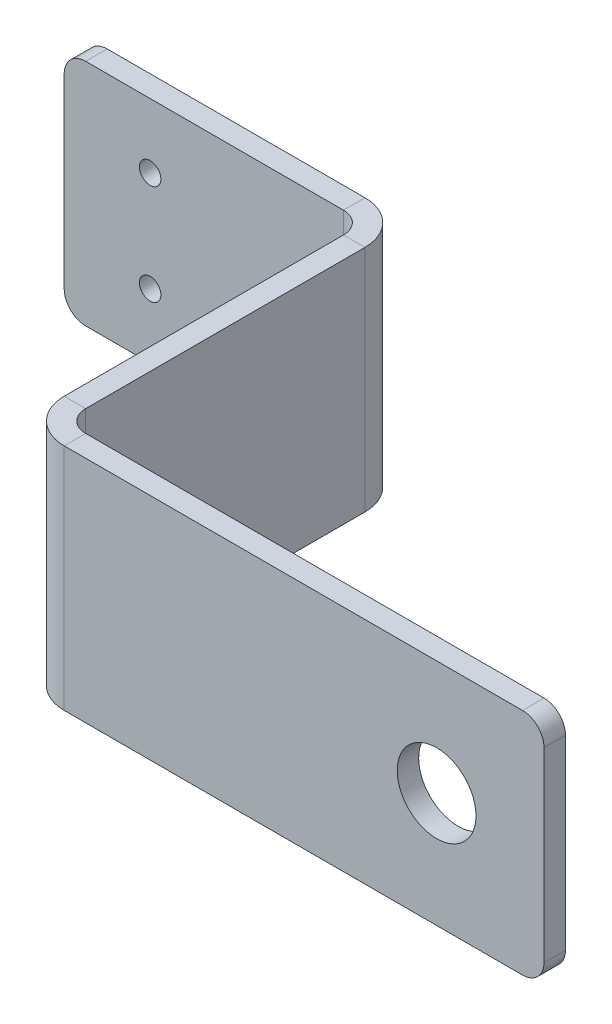
ISO-10303-21;
HEADER;
FILE_DESCRIPTION(('STEP AP214'),'2;1');
FILE_NAME('part.step','',(''),(''),'','','');
FILE_SCHEMA(('AUTOMOTIVE_DESIGN { 1 0 10303 214 1 1 1 1 }'));
ENDSEC;
DATA;
#1=APPLICATION_CONTEXT('core data for automotive mechanical design processes');
#2=APPLICATION_PROTOCOL_DEFINITION('international standard','automotive_design',2000,#1);
#3=PRODUCT_CONTEXT('',#1,'mechanical');
#4=PRODUCT('Part','Part','',(#3));
#5=PRODUCT_RELATED_PRODUCT_CATEGORY('part','',(#4));
#6=PRODUCT_DEFINITION_FORMATION('','',#4);
#7=PRODUCT_DEFINITION_CONTEXT('part definition',#1,'design');
#8=PRODUCT_DEFINITION('design','',#6,#7);
#9=PRODUCT_DEFINITION_SHAPE('','',#8);
#10=(LENGTH_UNIT() NAMED_UNIT(*) SI_UNIT(.MILLI.,.METRE.));
#11=(NAMED_UNIT(*) PLANE_ANGLE_UNIT() SI_UNIT($,.RADIAN.));
#12=(NAMED_UNIT(*) SI_UNIT($,.STERADIAN.) SOLID_ANGLE_UNIT());
#13=UNCERTAINTY_MEASURE_WITH_UNIT(LENGTH_MEASURE(1.E-05),#10,'distance_accuracy_value','');
#14=(GEOMETRIC_REPRESENTATION_CONTEXT(3) GLOBAL_UNCERTAINTY_ASSIGNED_CONTEXT((#13)) GLOBAL_UNIT_ASSIGNED_CONTEXT((#10,
#11,#12)) REPRESENTATION_CONTEXT('',''));
#15=CARTESIAN_POINT('',(0.,0.,0.));
#16=DIRECTION('',(0.,0.,1.));
#17=DIRECTION('',(1.,0.,0.));
#18=AXIS2_PLACEMENT_3D('',#15,#16,#17);
#19=CARTESIAN_POINT('',(-70.,32.,-42.));
#20=DIRECTION('',(0.,1.,0.));
#21=DIRECTION('',(0.,0.,1.));
#22=AXIS2_PLACEMENT_3D('',#19,#20,#21);
#23=PLANE('',#22);
#24=DIRECTION('',(-1.,0.,0.));
#25=VECTOR('',#24,1.);
#26=CARTESIAN_POINT('',(-70.,32.,-42.));
#27=LINE('',#26,#25);
#28=CARTESIAN_POINT('',(-70.,32.,-42.));
#29=VERTEX_POINT('',#28);
#30=CARTESIAN_POINT('',(-73.,32.,-42.));
#31=VERTEX_POINT('',#30);
#32=EDGE_CURVE('E279',#29,#31,#27,.T.);
#33=ORIENTED_EDGE('',*,*,#32,.F.);
#34=CARTESIAN_POINT('',(-76.,32.,-42.));
#35=DIRECTION('',(0.,1.,0.));
#36=DIRECTION('',(0.,0.,1.));
#37=AXIS2_PLACEMENT_3D('',#34,#35,#36);
#38=CIRCLE('',#37,6.);
#39=CARTESIAN_POINT('',(-76.,32.,-48.));
#40=VERTEX_POINT('',#39);
#41=EDGE_CURVE('E196',#40,#29,#38,.F.);
#42=ORIENTED_EDGE('',*,*,#41,.F.);
#43=DIRECTION('',(0.,0.,-1.));
#44=VECTOR('',#43,1.);
#45=CARTESIAN_POINT('',(-76.,32.,-45.));
#46=LINE('',#45,#44);
#47=CARTESIAN_POINT('',(-76.,32.,-45.));
#48=VERTEX_POINT('',#47);
#49=EDGE_CURVE('E276',#48,#40,#46,.T.);
#50=ORIENTED_EDGE('',*,*,#49,.F.);
#51=CARTESIAN_POINT('',(-76.,32.,-42.));
#52=DIRECTION('',(0.,1.,0.));
#53=DIRECTION('',(1.,0.,0.));
#54=AXIS2_PLACEMENT_3D('',#51,#52,#53);
#55=CIRCLE('',#54,3.);
#56=EDGE_CURVE('E206',#48,#31,#55,.F.);
#57=ORIENTED_EDGE('',*,*,#56,.T.);
#58=EDGE_LOOP('',(#33,#42,#50,#57));
#59=FACE_BOUND('',#58,.T.);
#60=ADVANCED_FACE('F41',(#59),#23,.T.);
#61=CARTESIAN_POINT('',(-76.,32.,-45.));
#62=DIRECTION('',(0.,1.,0.));
#63=DIRECTION('',(0.,0.,1.));
#64=AXIS2_PLACEMENT_3D('',#61,#62,#63);
#65=PLANE('',#64);
#66=DIRECTION('',(0.,0.,1.));
#67=VECTOR('',#66,1.);
#68=CARTESIAN_POINT('',(-70.,32.,-48.));
#69=LINE('',#68,#67);
#70=CARTESIAN_POINT('',(-70.,32.,-3.));
#71=VERTEX_POINT('',#70);
#72=EDGE_CURVE('E194',#29,#71,#69,.T.);
#73=ORIENTED_EDGE('',*,*,#72,.F.);
#74=ORIENTED_EDGE('',*,*,#32,.T.);
#75=DIRECTION('',(0.,0.,-1.));
#76=VECTOR('',#75,1.);
#77=CARTESIAN_POINT('',(-73.,32.,-48.));
#78=LINE('',#77,#76);
#79=CARTESIAN_POINT('',(-73.,32.,-3.));
#80=VERTEX_POINT('',#79);
#81=EDGE_CURVE('E209',#31,#80,#78,.F.);
#82=ORIENTED_EDGE('',*,*,#81,.T.);
#83=DIRECTION('',(1.,0.,0.));
#84=VECTOR('',#83,1.);
#85=CARTESIAN_POINT('',(-73.,32.,-3.));
#86=LINE('',#85,#84);
#87=EDGE_CURVE('E168',#80,#71,#86,.T.);
#88=ORIENTED_EDGE('',*,*,#87,.T.);
#89=EDGE_LOOP('',(#73,#74,#82,#88));
#90=FACE_BOUND('',#89,.T.);
#91=ADVANCED_FACE('F345',(#90),#65,.T.);
#92=CARTESIAN_POINT('',(-76.,0.,-48.));
#93=DIRECTION('',(0.,-1.,0.));
#94=DIRECTION('',(0.,0.,-1.));
#95=AXIS2_PLACEMENT_3D('',#92,#93,#94);
#96=PLANE('',#95);
#97=DIRECTION('',(0.,0.,1.));
#98=VECTOR('',#97,1.);
#99=CARTESIAN_POINT('',(-76.,0.,-48.));
#100=LINE('',#99,#98);
#101=CARTESIAN_POINT('',(-76.,0.,-48.));
#102=VERTEX_POINT('',#101);
#103=CARTESIAN_POINT('',(-76.,0.,-45.));
#104=VERTEX_POINT('',#103);
#105=EDGE_CURVE('E273',#102,#104,#100,.T.);
#106=ORIENTED_EDGE('',*,*,#105,.F.);
#107=CARTESIAN_POINT('',(-76.,0.,-42.));
#108=DIRECTION('',(0.,1.,0.));
#109=DIRECTION('',(0.,0.,1.));
#110=AXIS2_PLACEMENT_3D('',#107,#108,#109);
#111=CIRCLE('',#110,6.);
#112=CARTESIAN_POINT('',(-70.,0.,-42.));
#113=VERTEX_POINT('',#112);
#114=EDGE_CURVE('E224',#102,#113,#111,.F.);
#115=ORIENTED_EDGE('',*,*,#114,.T.);
#116=DIRECTION('',(1.,0.,0.));
#117=VECTOR('',#116,1.);
#118=CARTESIAN_POINT('',(-73.,0.,-42.));
#119=LINE('',#118,#117);
#120=CARTESIAN_POINT('',(-73.,0.,-42.));
#121=VERTEX_POINT('',#120);
#122=EDGE_CURVE('E167',#121,#113,#119,.T.);
#123=ORIENTED_EDGE('',*,*,#122,.F.);
#124=CARTESIAN_POINT('',(-76.,0.,-42.));
#125=DIRECTION('',(0.,1.,0.));
#126=DIRECTION('',(1.,0.,0.));
#127=AXIS2_PLACEMENT_3D('',#124,#125,#126);
#128=CIRCLE('',#127,3.);
#129=EDGE_CURVE('E231',#104,#121,#128,.F.);
#130=ORIENTED_EDGE('',*,*,#129,.F.);
#131=EDGE_LOOP('',(#106,#115,#123,#130));
#132=FACE_BOUND('',#131,.T.);
#133=ADVANCED_FACE('F399',(#132),#96,.T.);
#134=CARTESIAN_POINT('',(-73.,0.,-42.));
#135=DIRECTION('',(0.,-1.,0.));
#136=DIRECTION('',(0.,0.,-1.));
#137=AXIS2_PLACEMENT_3D('',#134,#135,#136);
#138=PLANE('',#137);
#139=DIRECTION('',(1.,0.,0.));
#140=VECTOR('',#139,1.);
#141=CARTESIAN_POINT('',(-115.,0.,-45.));
#142=LINE('',#141,#140);
#143=CARTESIAN_POINT('',(-112.,0.,-45.));
#144=VERTEX_POINT('',#143);
#145=EDGE_CURVE('E229',#144,#104,#142,.T.);
#146=ORIENTED_EDGE('',*,*,#145,.F.);
#147=DIRECTION('',(0.,0.,-1.));
#148=VECTOR('',#147,1.);
#149=CARTESIAN_POINT('',(-112.,0.,-42.));
#150=LINE('',#149,#148);
#151=CARTESIAN_POINT('',(-112.,0.,-48.));
#152=VERTEX_POINT('',#151);
#153=EDGE_CURVE('E298',#144,#152,#150,.T.);
#154=ORIENTED_EDGE('',*,*,#153,.T.);
#155=DIRECTION('',(1.,0.,0.));
#156=VECTOR('',#155,1.);
#157=CARTESIAN_POINT('',(-115.,0.,-48.));
#158=LINE('',#157,#156);
#159=EDGE_CURVE('E227',#152,#102,#158,.T.);
#160=ORIENTED_EDGE('',*,*,#159,.T.);
#161=ORIENTED_EDGE('',*,*,#105,.T.);
#162=EDGE_LOOP('',(#146,#154,#160,#161));
#163=FACE_BOUND('',#162,.T.);
#164=ADVANCED_FACE('F318',(#163),#138,.T.);
#165=CARTESIAN_POINT('',(-67.,32.,0.));
#166=DIRECTION('',(0.,1.,0.));
#167=DIRECTION('',(0.,0.,1.));
#168=AXIS2_PLACEMENT_3D('',#165,#166,#167);
#169=PLANE('',#168);
#170=DIRECTION('',(0.,0.,1.));
#171=VECTOR('',#170,1.);
#172=CARTESIAN_POINT('',(-67.,32.,0.));
#173=LINE('',#172,#171);
#174=CARTESIAN_POINT('',(-67.,32.,0.));
#175=VERTEX_POINT('',#174);
#176=CARTESIAN_POINT('',(-67.,32.,3.));
#177=VERTEX_POINT('',#176);
#178=EDGE_CURVE('E155',#175,#177,#173,.T.);
#179=ORIENTED_EDGE('',*,*,#178,.F.);
#180=CARTESIAN_POINT('',(-67.,32.,-3.));
#181=DIRECTION('',(0.,-1.,0.));
#182=DIRECTION('',(0.,0.,-1.));
#183=AXIS2_PLACEMENT_3D('',#180,#181,#182);
#184=CIRCLE('',#183,3.);
#185=EDGE_CURVE('E159',#71,#175,#184,.F.);
#186=ORIENTED_EDGE('',*,*,#185,.F.);
#187=ORIENTED_EDGE('',*,*,#87,.F.);
#188=CARTESIAN_POINT('',(-67.,32.,-3.));
#189=DIRECTION('',(0.,1.,0.));
#190=DIRECTION('',(1.,0.,0.));
#191=AXIS2_PLACEMENT_3D('',#188,#189,#190);
#192=CIRCLE('',#191,6.);
#193=EDGE_CURVE('E162',#80,#177,#192,.T.);
#194=ORIENTED_EDGE('',*,*,#193,.T.);
#195=EDGE_LOOP('',(#179,#186,#187,#194));
#196=FACE_BOUND('',#195,.T.);
#197=ADVANCED_FACE('F157',(#196),#169,.T.);
#198=CARTESIAN_POINT('',(-73.,32.,-3.));
#199=DIRECTION('',(0.,1.,0.));
#200=DIRECTION('',(0.,0.,1.));
#201=AXIS2_PLACEMENT_3D('',#198,#199,#200);
#202=PLANE('',#201);
#203=DIRECTION('',(1.,0.,0.));
#204=VECTOR('',#203,1.);
#205=CARTESIAN_POINT('',(-70.,32.,3.));
#206=LINE('',#205,#204);
#207=CARTESIAN_POINT('',(-3.,32.,3.));
#208=VERTEX_POINT('',#207);
#209=EDGE_CURVE('E189',#177,#208,#206,.T.);
#210=ORIENTED_EDGE('',*,*,#209,.T.);
#211=DIRECTION('',(0.,0.,1.));
#212=VECTOR('',#211,1.);
#213=CARTESIAN_POINT('',(-3.,32.,-3.));
#214=LINE('',#213,#212);
#215=CARTESIAN_POINT('',(-3.,32.,0.));
#216=VERTEX_POINT('',#215);
#217=EDGE_CURVE('E188',#208,#216,#214,.F.);
#218=ORIENTED_EDGE('',*,*,#217,.T.);
#219=DIRECTION('',(1.,0.,0.));
#220=VECTOR('',#219,1.);
#221=CARTESIAN_POINT('',(-70.,32.,0.));
#222=LINE('',#221,#220);
#223=EDGE_CURVE('E176',#175,#216,#222,.T.);
#224=ORIENTED_EDGE('',*,*,#223,.F.);
#225=ORIENTED_EDGE('',*,*,#178,.T.);
#226=EDGE_LOOP('',(#210,#218,#224,#225));
#227=FACE_BOUND('',#226,.T.);
#228=ADVANCED_FACE('F186',(#227),#202,.T.);
#229=CARTESIAN_POINT('',(-70.,0.,-3.));
#230=DIRECTION('',(0.,-1.,0.));
#231=DIRECTION('',(0.,0.,-1.));
#232=AXIS2_PLACEMENT_3D('',#229,#230,#231);
#233=PLANE('',#232);
#234=DIRECTION('',(-1.,0.,0.));
#235=VECTOR('',#234,1.);
#236=CARTESIAN_POINT('',(-70.,0.,-3.));
#237=LINE('',#236,#235);
#238=CARTESIAN_POINT('',(-70.,0.,-3.));
#239=VERTEX_POINT('',#238);
#240=CARTESIAN_POINT('',(-73.,0.,-3.));
#241=VERTEX_POINT('',#240);
#242=EDGE_CURVE('E269',#239,#241,#237,.T.);
#243=ORIENTED_EDGE('',*,*,#242,.F.);
#244=CARTESIAN_POINT('',(-67.,0.,-3.));
#245=DIRECTION('',(0.,-1.,0.));
#246=DIRECTION('',(0.,0.,-1.));
#247=AXIS2_PLACEMENT_3D('',#244,#245,#246);
#248=CIRCLE('',#247,3.);
#249=CARTESIAN_POINT('',(-67.,0.,0.));
#250=VERTEX_POINT('',#249);
#251=EDGE_CURVE('E219',#239,#250,#248,.F.);
#252=ORIENTED_EDGE('',*,*,#251,.T.);
#253=DIRECTION('',(0.,0.,-1.));
#254=VECTOR('',#253,1.);
#255=CARTESIAN_POINT('',(-67.,0.,3.));
#256=LINE('',#255,#254);
#257=CARTESIAN_POINT('',(-67.,0.,3.));
#258=VERTEX_POINT('',#257);
#259=EDGE_CURVE('E267',#258,#250,#256,.T.);
#260=ORIENTED_EDGE('',*,*,#259,.F.);
#261=CARTESIAN_POINT('',(-67.,0.,-3.));
#262=DIRECTION('',(0.,1.,0.));
#263=DIRECTION('',(1.,0.,0.));
#264=AXIS2_PLACEMENT_3D('',#261,#262,#263);
#265=CIRCLE('',#264,6.);
#266=EDGE_CURVE('E237',#241,#258,#265,.T.);
#267=ORIENTED_EDGE('',*,*,#266,.F.);
#268=EDGE_LOOP('',(#243,#252,#260,#267));
#269=FACE_BOUND('',#268,.T.);
#270=ADVANCED_FACE('F391',(#269),#233,.T.);
#271=CARTESIAN_POINT('',(-67.,0.,3.));
#272=DIRECTION('',(0.,-1.,0.));
#273=DIRECTION('',(0.,0.,-1.));
#274=AXIS2_PLACEMENT_3D('',#271,#272,#273);
#275=PLANE('',#274);
#276=DIRECTION('',(0.,0.,1.));
#277=VECTOR('',#276,1.);
#278=CARTESIAN_POINT('',(-70.,0.,-48.));
#279=LINE('',#278,#277);
#280=EDGE_CURVE('E221',#113,#239,#279,.T.);
#281=ORIENTED_EDGE('',*,*,#280,.T.);
#282=ORIENTED_EDGE('',*,*,#242,.T.);
#283=DIRECTION('',(0.,0.,-1.));
#284=VECTOR('',#283,1.);
#285=CARTESIAN_POINT('',(-73.,0.,-48.));
#286=LINE('',#285,#284);
#287=EDGE_CURVE('E234',#121,#241,#286,.F.);
#288=ORIENTED_EDGE('',*,*,#287,.F.);
#289=ORIENTED_EDGE('',*,*,#122,.T.);
#290=EDGE_LOOP('',(#281,#282,#288,#289));
#291=FACE_BOUND('',#290,.T.);
#292=ADVANCED_FACE('F382',(#291),#275,.T.);
#293=CARTESIAN_POINT('',(-70.,32.,3.));
#294=DIRECTION('',(0.,0.,-1.));
#295=DIRECTION('',(-1.,0.,0.));
#296=AXIS2_PLACEMENT_3D('',#293,#294,#295);
#297=PLANE('',#296);
#298=CARTESIAN_POINT('',(-15.,16.,3.));
#299=DIRECTION('',(0.,0.,1.));
#300=DIRECTION('',(1.,0.,0.));
#301=AXIS2_PLACEMENT_3D('',#298,#299,#300);
#302=CIRCLE('',#301,5.5);
#303=CARTESIAN_POINT('',(-9.5,16.,3.));
#304=VERTEX_POINT('',#303);
#305=EDGE_CURVE('E364',#304,#304,#302,.T.);
#306=ORIENTED_EDGE('',*,*,#305,.F.);
#307=EDGE_LOOP('',(#306));
#308=FACE_BOUND('',#307,.T.);
#309=DIRECTION('',(0.,-1.,0.));
#310=VECTOR('',#309,1.);
#311=CARTESIAN_POINT('',(0.,32.,3.));
#312=LINE('',#311,#310);
#313=CARTESIAN_POINT('',(0.,29.,3.));
#314=VERTEX_POINT('',#313);
#315=CARTESIAN_POINT('',(0.,3.,3.));
#316=VERTEX_POINT('',#315);
#317=EDGE_CURVE('E264',#314,#316,#312,.T.);
#318=ORIENTED_EDGE('',*,*,#317,.F.);
#319=CARTESIAN_POINT('',(-3.,29.,3.));
#320=DIRECTION('',(0.,0.,-1.));
#321=DIRECTION('',(-1.,0.,0.));
#322=AXIS2_PLACEMENT_3D('',#319,#320,#321);
#323=CIRCLE('',#322,3.);
#324=EDGE_CURVE('E288',#314,#208,#323,.F.);
#325=ORIENTED_EDGE('',*,*,#324,.T.);
#326=ORIENTED_EDGE('',*,*,#209,.F.);
#327=DIRECTION('',(0.,-1.,0.));
#328=VECTOR('',#327,1.);
#329=CARTESIAN_POINT('',(-67.,32.,3.));
#330=LINE('',#329,#328);
#331=EDGE_CURVE('E213',#177,#258,#330,.T.);
#332=ORIENTED_EDGE('',*,*,#331,.T.);
#333=DIRECTION('',(1.,0.,0.));
#334=VECTOR('',#333,1.);
#335=CARTESIAN_POINT('',(-70.,0.,3.));
#336=LINE('',#335,#334);
#337=CARTESIAN_POINT('',(-3.,0.,3.));
#338=VERTEX_POINT('',#337);
#339=EDGE_CURVE('E214',#258,#338,#336,.T.);
#340=ORIENTED_EDGE('',*,*,#339,.T.);
#341=CARTESIAN_POINT('',(-3.,3.,3.));
#342=DIRECTION('',(0.,0.,-1.));
#343=DIRECTION('',(-1.,0.,0.));
#344=AXIS2_PLACEMENT_3D('',#341,#342,#343);
#345=CIRCLE('',#344,3.);
#346=EDGE_CURVE('E286',#338,#316,#345,.F.);
#347=ORIENTED_EDGE('',*,*,#346,.T.);
#348=EDGE_LOOP('',(#318,#325,#326,#332,#340,#347));
#349=FACE_BOUND('',#348,.T.);
#350=ADVANCED_FACE('F358',(#308,#349),#297,.F.);
#351=CARTESIAN_POINT('',(0.,32.,0.));
#352=DIRECTION('',(1.,0.,0.));
#353=DIRECTION('',(0.,0.,-1.));
#354=AXIS2_PLACEMENT_3D('',#351,#352,#353);
#355=PLANE('',#354);
#356=DIRECTION('',(0.,-1.,0.));
#357=VECTOR('',#356,1.);
#358=CARTESIAN_POINT('',(0.,32.,0.));
#359=LINE('',#358,#357);
#360=CARTESIAN_POINT('',(0.,29.,0.));
#361=VERTEX_POINT('',#360);
#362=CARTESIAN_POINT('',(0.,3.,0.));
#363=VERTEX_POINT('',#362);
#364=EDGE_CURVE('E183',#361,#363,#359,.T.);
#365=ORIENTED_EDGE('',*,*,#364,.F.);
#366=DIRECTION('',(0.,0.,1.));
#367=VECTOR('',#366,1.);
#368=CARTESIAN_POINT('',(0.,29.,0.));
#369=LINE('',#368,#367);
#370=EDGE_CURVE('E283',#361,#314,#369,.T.);
#371=ORIENTED_EDGE('',*,*,#370,.T.);
#372=ORIENTED_EDGE('',*,*,#317,.T.);
#373=DIRECTION('',(0.,0.,1.));
#374=VECTOR('',#373,1.);
#375=CARTESIAN_POINT('',(0.,3.,0.));
#376=LINE('',#375,#374);
#377=EDGE_CURVE('E281',#316,#363,#376,.F.);
#378=ORIENTED_EDGE('',*,*,#377,.T.);
#379=EDGE_LOOP('',(#365,#371,#372,#378));
#380=FACE_BOUND('',#379,.T.);
#381=ADVANCED_FACE('F381',(#380),#355,.T.);
#382=CARTESIAN_POINT('',(-70.,32.,0.));
#383=DIRECTION('',(0.,0.,-1.));
#384=DIRECTION('',(-1.,0.,0.));
#385=AXIS2_PLACEMENT_3D('',#382,#383,#384);
#386=PLANE('',#385);
#387=CARTESIAN_POINT('',(-15.,16.,0.));
#388=DIRECTION('',(0.,0.,-1.));
#389=DIRECTION('',(-1.,0.,0.));
#390=AXIS2_PLACEMENT_3D('',#387,#388,#389);
#391=CIRCLE('',#390,5.5);
#392=CARTESIAN_POINT('',(-20.5,16.,0.));
#393=VERTEX_POINT('',#392);
#394=EDGE_CURVE('E372',#393,#393,#391,.F.);
#395=ORIENTED_EDGE('',*,*,#394,.T.);
#396=EDGE_LOOP('',(#395));
#397=FACE_BOUND('',#396,.T.);
#398=ORIENTED_EDGE('',*,*,#223,.T.);
#399=CARTESIAN_POINT('',(-3.,29.,0.));
#400=DIRECTION('',(0.,0.,-1.));
#401=DIRECTION('',(-1.,0.,0.));
#402=AXIS2_PLACEMENT_3D('',#399,#400,#401);
#403=CIRCLE('',#402,3.);
#404=EDGE_CURVE('E293',#216,#361,#403,.T.);
#405=ORIENTED_EDGE('',*,*,#404,.T.);
#406=ORIENTED_EDGE('',*,*,#364,.T.);
#407=CARTESIAN_POINT('',(-3.,3.,0.));
#408=DIRECTION('',(0.,0.,-1.));
#409=DIRECTION('',(-1.,0.,0.));
#410=AXIS2_PLACEMENT_3D('',#407,#408,#409);
#411=CIRCLE('',#410,3.);
#412=CARTESIAN_POINT('',(-3.,0.,0.));
#413=VERTEX_POINT('',#412);
#414=EDGE_CURVE('E291',#363,#413,#411,.T.);
#415=ORIENTED_EDGE('',*,*,#414,.T.);
#416=DIRECTION('',(1.,0.,0.));
#417=VECTOR('',#416,1.);
#418=CARTESIAN_POINT('',(-70.,0.,0.));
#419=LINE('',#418,#417);
#420=EDGE_CURVE('E179',#250,#413,#419,.T.);
#421=ORIENTED_EDGE('',*,*,#420,.F.);
#422=DIRECTION('',(0.,-1.,0.));
#423=VECTOR('',#422,1.);
#424=CARTESIAN_POINT('',(-67.,32.,0.));
#425=LINE('',#424,#423);
#426=EDGE_CURVE('E174',#175,#250,#425,.T.);
#427=ORIENTED_EDGE('',*,*,#426,.F.);
#428=EDGE_LOOP('',(#398,#405,#406,#415,#421,#427));
#429=FACE_BOUND('',#428,.T.);
#430=ADVANCED_FACE('F175',(#397,#429),#386,.T.);
#431=CARTESIAN_POINT('',(-67.,32.,-3.));
#432=DIRECTION('',(0.,-1.,0.));
#433=DIRECTION('',(0.,0.,-1.));
#434=AXIS2_PLACEMENT_3D('',#431,#432,#433);
#435=CYLINDRICAL_SURFACE('',#434,3.);
#436=ORIENTED_EDGE('',*,*,#251,.F.);
#437=DIRECTION('',(0.,-1.,0.));
#438=VECTOR('',#437,1.);
#439=CARTESIAN_POINT('',(-70.,32.,-3.));
#440=LINE('',#439,#438);
#441=EDGE_CURVE('E184',#71,#239,#440,.T.);
#442=ORIENTED_EDGE('',*,*,#441,.F.);
#443=ORIENTED_EDGE('',*,*,#185,.T.);
#444=ORIENTED_EDGE('',*,*,#426,.T.);
#445=EDGE_LOOP('',(#436,#442,#443,#444));
#446=FACE_BOUND('',#445,.T.);
#447=ADVANCED_FACE('F192',(#446),#435,.F.);
#448=CARTESIAN_POINT('',(-70.,32.,-48.));
#449=DIRECTION('',(1.,0.,0.));
#450=DIRECTION('',(0.,0.,-1.));
#451=AXIS2_PLACEMENT_3D('',#448,#449,#450);
#452=PLANE('',#451);
#453=ORIENTED_EDGE('',*,*,#280,.F.);
#454=DIRECTION('',(0.,-1.,0.));
#455=VECTOR('',#454,1.);
#456=CARTESIAN_POINT('',(-70.,32.,-42.));
#457=LINE('',#456,#455);
#458=EDGE_CURVE('E258',#29,#113,#457,.T.);
#459=ORIENTED_EDGE('',*,*,#458,.F.);
#460=ORIENTED_EDGE('',*,*,#72,.T.);
#461=ORIENTED_EDGE('',*,*,#441,.T.);
#462=EDGE_LOOP('',(#453,#459,#460,#461));
#463=FACE_BOUND('',#462,.T.);
#464=ADVANCED_FACE('F344',(#463),#452,.T.);
#465=CARTESIAN_POINT('',(-76.,32.,-42.));
#466=DIRECTION('',(0.,-1.,0.));
#467=DIRECTION('',(0.,0.,-1.));
#468=AXIS2_PLACEMENT_3D('',#465,#466,#467);
#469=CYLINDRICAL_SURFACE('',#468,6.);
#470=ORIENTED_EDGE('',*,*,#114,.F.);
#471=DIRECTION('',(0.,-1.,0.));
#472=VECTOR('',#471,1.);
#473=CARTESIAN_POINT('',(-76.,32.,-48.));
#474=LINE('',#473,#472);
#475=EDGE_CURVE('E255',#40,#102,#474,.T.);
#476=ORIENTED_EDGE('',*,*,#475,.F.);
#477=ORIENTED_EDGE('',*,*,#41,.T.);
#478=ORIENTED_EDGE('',*,*,#458,.T.);
#479=EDGE_LOOP('',(#470,#476,#477,#478));
#480=FACE_BOUND('',#479,.T.);
#481=ADVANCED_FACE('F336',(#480),#469,.T.);
#482=CARTESIAN_POINT('',(-115.,32.,-48.));
#483=DIRECTION('',(0.,0.,-1.));
#484=DIRECTION('',(-1.,0.,0.));
#485=AXIS2_PLACEMENT_3D('',#482,#483,#484);
#486=PLANE('',#485);
#487=CARTESIAN_POINT('',(-103.,23.,-48.));
#488=DIRECTION('',(0.,0.,-1.));
#489=DIRECTION('',(-1.,0.,0.));
#490=AXIS2_PLACEMENT_3D('',#487,#488,#489);
#491=CIRCLE('',#490,1.5);
#492=CARTESIAN_POINT('',(-104.5,23.,-48.));
#493=VERTEX_POINT('',#492);
#494=EDGE_CURVE('E367',#493,#493,#491,.F.);
#495=ORIENTED_EDGE('',*,*,#494,.T.);
#496=EDGE_LOOP('',(#495));
#497=FACE_BOUND('',#496,.T.);
#498=CARTESIAN_POINT('',(-103.,9.,-48.));
#499=DIRECTION('',(0.,0.,-1.));
#500=DIRECTION('',(-1.,0.,0.));
#501=AXIS2_PLACEMENT_3D('',#498,#499,#500);
#502=CIRCLE('',#501,1.5);
#503=CARTESIAN_POINT('',(-104.5,9.,-48.));
#504=VERTEX_POINT('',#503);
#505=EDGE_CURVE('E363',#504,#504,#502,.F.);
#506=ORIENTED_EDGE('',*,*,#505,.T.);
#507=EDGE_LOOP('',(#506));
#508=FACE_BOUND('',#507,.T.);
#509=ORIENTED_EDGE('',*,*,#159,.F.);
#510=CARTESIAN_POINT('',(-112.,3.,-48.));
#511=DIRECTION('',(0.,0.,-1.));
#512=DIRECTION('',(-1.,0.,0.));
#513=AXIS2_PLACEMENT_3D('',#510,#511,#512);
#514=CIRCLE('',#513,3.);
#515=CARTESIAN_POINT('',(-115.,3.,-48.));
#516=VERTEX_POINT('',#515);
#517=EDGE_CURVE('E303',#152,#516,#514,.T.);
#518=ORIENTED_EDGE('',*,*,#517,.T.);
#519=DIRECTION('',(0.,-1.,0.));
#520=VECTOR('',#519,1.);
#521=CARTESIAN_POINT('',(-115.,32.,-48.));
#522=LINE('',#521,#520);
#523=CARTESIAN_POINT('',(-115.,29.,-48.));
#524=VERTEX_POINT('',#523);
#525=EDGE_CURVE('E253',#524,#516,#522,.T.);
#526=ORIENTED_EDGE('',*,*,#525,.F.);
#527=CARTESIAN_POINT('',(-112.,29.,-48.));
#528=DIRECTION('',(0.,0.,-1.));
#529=DIRECTION('',(-1.,0.,0.));
#530=AXIS2_PLACEMENT_3D('',#527,#528,#529);
#531=CIRCLE('',#530,3.);
#532=CARTESIAN_POINT('',(-112.,32.,-48.));
#533=VERTEX_POINT('',#532);
#534=EDGE_CURVE('E301',#524,#533,#531,.T.);
#535=ORIENTED_EDGE('',*,*,#534,.T.);
#536=DIRECTION('',(1.,0.,0.));
#537=VECTOR('',#536,1.);
#538=CARTESIAN_POINT('',(-115.,32.,-48.));
#539=LINE('',#538,#537);
#540=EDGE_CURVE('E202',#533,#40,#539,.T.);
#541=ORIENTED_EDGE('',*,*,#540,.T.);
#542=ORIENTED_EDGE('',*,*,#475,.T.);
#543=EDGE_LOOP('',(#509,#518,#526,#535,#541,#542));
#544=FACE_BOUND('',#543,.T.);
#545=ADVANCED_FACE('F324',(#497,#508,#544),#486,.T.);
#546=CARTESIAN_POINT('',(-115.,32.,-45.));
#547=DIRECTION('',(-1.,0.,0.));
#548=DIRECTION('',(0.,0.,1.));
#549=AXIS2_PLACEMENT_3D('',#546,#547,#548);
#550=PLANE('',#549);
#551=ORIENTED_EDGE('',*,*,#525,.T.);
#552=DIRECTION('',(0.,0.,-1.));
#553=VECTOR('',#552,1.);
#554=CARTESIAN_POINT('',(-115.,3.,-45.));
#555=LINE('',#554,#553);
#556=CARTESIAN_POINT('',(-115.,3.,-45.));
#557=VERTEX_POINT('',#556);
#558=EDGE_CURVE('E62',#516,#557,#555,.F.);
#559=ORIENTED_EDGE('',*,*,#558,.T.);
#560=DIRECTION('',(0.,-1.,0.));
#561=VECTOR('',#560,1.);
#562=CARTESIAN_POINT('',(-115.,32.,-45.));
#563=LINE('',#562,#561);
#564=CARTESIAN_POINT('',(-115.,29.,-45.));
#565=VERTEX_POINT('',#564);
#566=EDGE_CURVE('E251',#565,#557,#563,.T.);
#567=ORIENTED_EDGE('',*,*,#566,.F.);
#568=DIRECTION('',(0.,0.,-1.));
#569=VECTOR('',#568,1.);
#570=CARTESIAN_POINT('',(-115.,29.,-48.));
#571=LINE('',#570,#569);
#572=EDGE_CURVE('E305',#565,#524,#571,.T.);
#573=ORIENTED_EDGE('',*,*,#572,.T.);
#574=EDGE_LOOP('',(#551,#559,#567,#573));
#575=FACE_BOUND('',#574,.T.);
#576=ADVANCED_FACE('F325',(#575),#550,.T.);
#577=CARTESIAN_POINT('',(-115.,32.,-45.));
#578=DIRECTION('',(0.,0.,-1.));
#579=DIRECTION('',(-1.,0.,0.));
#580=AXIS2_PLACEMENT_3D('',#577,#578,#579);
#581=PLANE('',#580);
#582=CARTESIAN_POINT('',(-103.,23.,-45.));
#583=DIRECTION('',(0.,0.,1.));
#584=DIRECTION('',(1.,0.,0.));
#585=AXIS2_PLACEMENT_3D('',#582,#583,#584);
#586=CIRCLE('',#585,1.5);
#587=CARTESIAN_POINT('',(-101.5,23.,-45.));
#588=VERTEX_POINT('',#587);
#589=EDGE_CURVE('E217',#588,#588,#586,.T.);
#590=ORIENTED_EDGE('',*,*,#589,.F.);
#591=EDGE_LOOP('',(#590));
#592=FACE_BOUND('',#591,.T.);
#593=CARTESIAN_POINT('',(-103.,9.,-45.));
#594=DIRECTION('',(0.,0.,1.));
#595=DIRECTION('',(1.,0.,0.));
#596=AXIS2_PLACEMENT_3D('',#593,#594,#595);
#597=CIRCLE('',#596,1.5);
#598=CARTESIAN_POINT('',(-101.5,9.,-45.));
#599=VERTEX_POINT('',#598);
#600=EDGE_CURVE('E360',#599,#599,#597,.T.);
#601=ORIENTED_EDGE('',*,*,#600,.F.);
#602=EDGE_LOOP('',(#601));
#603=FACE_BOUND('',#602,.T.);
#604=ORIENTED_EDGE('',*,*,#566,.T.);
#605=CARTESIAN_POINT('',(-112.,3.,-45.));
#606=DIRECTION('',(0.,0.,-1.));
#607=DIRECTION('',(-1.,0.,0.));
#608=AXIS2_PLACEMENT_3D('',#605,#606,#607);
#609=CIRCLE('',#608,3.);
#610=EDGE_CURVE('E49',#557,#144,#609,.F.);
#611=ORIENTED_EDGE('',*,*,#610,.T.);
#612=ORIENTED_EDGE('',*,*,#145,.T.);
#613=DIRECTION('',(0.,-1.,0.));
#614=VECTOR('',#613,1.);
#615=CARTESIAN_POINT('',(-76.,32.,-45.));
#616=LINE('',#615,#614);
#617=EDGE_CURVE('E248',#48,#104,#616,.T.);
#618=ORIENTED_EDGE('',*,*,#617,.F.);
#619=DIRECTION('',(1.,0.,0.));
#620=VECTOR('',#619,1.);
#621=CARTESIAN_POINT('',(-115.,32.,-45.));
#622=LINE('',#621,#620);
#623=CARTESIAN_POINT('',(-112.,32.,-45.));
#624=VERTEX_POINT('',#623);
#625=EDGE_CURVE('E204',#624,#48,#622,.T.);
#626=ORIENTED_EDGE('',*,*,#625,.F.);
#627=CARTESIAN_POINT('',(-112.,29.,-45.));
#628=DIRECTION('',(0.,0.,-1.));
#629=DIRECTION('',(-1.,0.,0.));
#630=AXIS2_PLACEMENT_3D('',#627,#628,#629);
#631=CIRCLE('',#630,3.);
#632=EDGE_CURVE('E309',#624,#565,#631,.F.);
#633=ORIENTED_EDGE('',*,*,#632,.T.);
#634=EDGE_LOOP('',(#604,#611,#612,#618,#626,#633));
#635=FACE_BOUND('',#634,.T.);
#636=ADVANCED_FACE('F313',(#592,#603,#635),#581,.F.);
#637=CARTESIAN_POINT('',(-76.,32.,-42.));
#638=DIRECTION('',(0.,-1.,0.));
#639=DIRECTION('',(0.,0.,-1.));
#640=AXIS2_PLACEMENT_3D('',#637,#638,#639);
#641=CYLINDRICAL_SURFACE('',#640,3.);
#642=ORIENTED_EDGE('',*,*,#129,.T.);
#643=DIRECTION('',(0.,-1.,0.));
#644=VECTOR('',#643,1.);
#645=CARTESIAN_POINT('',(-73.,32.,-42.));
#646=LINE('',#645,#644);
#647=EDGE_CURVE('E245',#31,#121,#646,.T.);
#648=ORIENTED_EDGE('',*,*,#647,.F.);
#649=ORIENTED_EDGE('',*,*,#56,.F.);
#650=ORIENTED_EDGE('',*,*,#617,.T.);
#651=EDGE_LOOP('',(#642,#648,#649,#650));
#652=FACE_BOUND('',#651,.T.);
#653=ADVANCED_FACE('F505',(#652),#641,.F.);
#654=CARTESIAN_POINT('',(-73.,32.,-48.));
#655=DIRECTION('',(1.,0.,0.));
#656=DIRECTION('',(0.,0.,-1.));
#657=AXIS2_PLACEMENT_3D('',#654,#655,#656);
#658=PLANE('',#657);
#659=ORIENTED_EDGE('',*,*,#287,.T.);
#660=DIRECTION('',(0.,-1.,0.));
#661=VECTOR('',#660,1.);
#662=CARTESIAN_POINT('',(-73.,32.,-3.));
#663=LINE('',#662,#661);
#664=EDGE_CURVE('E242',#80,#241,#663,.T.);
#665=ORIENTED_EDGE('',*,*,#664,.F.);
#666=ORIENTED_EDGE('',*,*,#81,.F.);
#667=ORIENTED_EDGE('',*,*,#647,.T.);
#668=EDGE_LOOP('',(#659,#665,#666,#667));
#669=FACE_BOUND('',#668,.T.);
#670=ADVANCED_FACE('F349',(#669),#658,.F.);
#671=CARTESIAN_POINT('',(-67.,32.,-3.));
#672=DIRECTION('',(0.,-1.,0.));
#673=DIRECTION('',(0.,0.,-1.));
#674=AXIS2_PLACEMENT_3D('',#671,#672,#673);
#675=CYLINDRICAL_SURFACE('',#674,6.);
#676=ORIENTED_EDGE('',*,*,#266,.T.);
#677=ORIENTED_EDGE('',*,*,#331,.F.);
#678=ORIENTED_EDGE('',*,*,#193,.F.);
#679=ORIENTED_EDGE('',*,*,#664,.T.);
#680=EDGE_LOOP('',(#676,#677,#678,#679));
#681=FACE_BOUND('',#680,.T.);
#682=ADVANCED_FACE('F353',(#681),#675,.T.);
#683=CARTESIAN_POINT('',(-67.,32.,-3.));
#684=DIRECTION('',(0.,-1.,0.));
#685=DIRECTION('',(-1.,0.,0.));
#686=AXIS2_PLACEMENT_3D('',#683,#684,#685);
#687=PLANE('',#686);
#688=ORIENTED_EDGE('',*,*,#540,.F.);
#689=DIRECTION('',(0.,0.,-1.));
#690=VECTOR('',#689,1.);
#691=CARTESIAN_POINT('',(-112.,32.,-45.));
#692=LINE('',#691,#690);
#693=EDGE_CURVE('E11',#533,#624,#692,.F.);
#694=ORIENTED_EDGE('',*,*,#693,.T.);
#695=ORIENTED_EDGE('',*,*,#625,.T.);
#696=ORIENTED_EDGE('',*,*,#49,.T.);
#697=EDGE_LOOP('',(#688,#694,#695,#696));
#698=FACE_BOUND('',#697,.T.);
#699=ADVANCED_FACE('F329',(#698),#687,.F.);
#700=CARTESIAN_POINT('',(-67.,0.,-3.));
#701=DIRECTION('',(0.,-1.,0.));
#702=DIRECTION('',(-1.,0.,0.));
#703=AXIS2_PLACEMENT_3D('',#700,#701,#702);
#704=PLANE('',#703);
#705=ORIENTED_EDGE('',*,*,#420,.T.);
#706=DIRECTION('',(0.,0.,1.));
#707=VECTOR('',#706,1.);
#708=CARTESIAN_POINT('',(-3.,0.,-3.));
#709=LINE('',#708,#707);
#710=EDGE_CURVE('E295',#413,#338,#709,.T.);
#711=ORIENTED_EDGE('',*,*,#710,.T.);
#712=ORIENTED_EDGE('',*,*,#339,.F.);
#713=ORIENTED_EDGE('',*,*,#259,.T.);
#714=EDGE_LOOP('',(#705,#711,#712,#713));
#715=FACE_BOUND('',#714,.T.);
#716=ADVANCED_FACE('F466',(#715),#704,.T.);
#717=CARTESIAN_POINT('',(-103.,9.,-48.001));
#718=DIRECTION('',(0.,0.,1.));
#719=DIRECTION('',(1.,0.,0.));
#720=AXIS2_PLACEMENT_3D('',#717,#718,#719);
#721=CYLINDRICAL_SURFACE('',#720,1.5);
#722=ORIENTED_EDGE('',*,*,#505,.F.);
#723=EDGE_LOOP('',(#722));
#724=FACE_BOUND('',#723,.T.);
#725=ORIENTED_EDGE('',*,*,#600,.T.);
#726=EDGE_LOOP('',(#725));
#727=FACE_BOUND('',#726,.T.);
#728=ADVANCED_FACE('F455',(#724,#727),#721,.F.);
#729=CARTESIAN_POINT('',(-103.,23.,-48.001));
#730=DIRECTION('',(0.,0.,1.));
#731=DIRECTION('',(1.,0.,0.));
#732=AXIS2_PLACEMENT_3D('',#729,#730,#731);
#733=CYLINDRICAL_SURFACE('',#732,1.5);
#734=ORIENTED_EDGE('',*,*,#494,.F.);
#735=EDGE_LOOP('',(#734));
#736=FACE_BOUND('',#735,.T.);
#737=ORIENTED_EDGE('',*,*,#589,.T.);
#738=EDGE_LOOP('',(#737));
#739=FACE_BOUND('',#738,.T.);
#740=ADVANCED_FACE('F443',(#736,#739),#733,.F.);
#741=CARTESIAN_POINT('',(-15.,16.,-48.001));
#742=DIRECTION('',(0.,0.,1.));
#743=DIRECTION('',(1.,0.,0.));
#744=AXIS2_PLACEMENT_3D('',#741,#742,#743);
#745=CYLINDRICAL_SURFACE('',#744,5.5);
#746=ORIENTED_EDGE('',*,*,#394,.F.);
#747=EDGE_LOOP('',(#746));
#748=FACE_BOUND('',#747,.T.);
#749=ORIENTED_EDGE('',*,*,#305,.T.);
#750=EDGE_LOOP('',(#749));
#751=FACE_BOUND('',#750,.T.);
#752=ADVANCED_FACE('F378',(#748,#751),#745,.F.);
#753=CARTESIAN_POINT('',(-3.,29.,0.));
#754=DIRECTION('',(0.,0.,1.));
#755=DIRECTION('',(1.,0.,0.));
#756=AXIS2_PLACEMENT_3D('',#753,#754,#755);
#757=CYLINDRICAL_SURFACE('',#756,3.);
#758=ORIENTED_EDGE('',*,*,#404,.F.);
#759=ORIENTED_EDGE('',*,*,#217,.F.);
#760=ORIENTED_EDGE('',*,*,#324,.F.);
#761=ORIENTED_EDGE('',*,*,#370,.F.);
#762=EDGE_LOOP('',(#758,#759,#760,#761));
#763=FACE_BOUND('',#762,.T.);
#764=ADVANCED_FACE('F403',(#763),#757,.T.);
#765=CARTESIAN_POINT('',(-3.,3.,-3.));
#766=DIRECTION('',(0.,0.,1.));
#767=DIRECTION('',(1.,0.,0.));
#768=AXIS2_PLACEMENT_3D('',#765,#766,#767);
#769=CYLINDRICAL_SURFACE('',#768,3.);
#770=ORIENTED_EDGE('',*,*,#414,.F.);
#771=ORIENTED_EDGE('',*,*,#377,.F.);
#772=ORIENTED_EDGE('',*,*,#346,.F.);
#773=ORIENTED_EDGE('',*,*,#710,.F.);
#774=EDGE_LOOP('',(#770,#771,#772,#773));
#775=FACE_BOUND('',#774,.T.);
#776=ADVANCED_FACE('F406',(#775),#769,.T.);
#777=CARTESIAN_POINT('',(-112.,3.,-42.));
#778=DIRECTION('',(0.,0.,-1.));
#779=DIRECTION('',(-1.,0.,0.));
#780=AXIS2_PLACEMENT_3D('',#777,#778,#779);
#781=CYLINDRICAL_SURFACE('',#780,3.);
#782=ORIENTED_EDGE('',*,*,#610,.F.);
#783=ORIENTED_EDGE('',*,*,#558,.F.);
#784=ORIENTED_EDGE('',*,*,#517,.F.);
#785=ORIENTED_EDGE('',*,*,#153,.F.);
#786=EDGE_LOOP('',(#782,#783,#784,#785));
#787=FACE_BOUND('',#786,.T.);
#788=ADVANCED_FACE('F321',(#787),#781,.T.);
#789=CARTESIAN_POINT('',(-112.,29.,-45.));
#790=DIRECTION('',(0.,0.,1.));
#791=DIRECTION('',(1.,0.,0.));
#792=AXIS2_PLACEMENT_3D('',#789,#790,#791);
#793=CYLINDRICAL_SURFACE('',#792,3.);
#794=ORIENTED_EDGE('',*,*,#632,.F.);
#795=ORIENTED_EDGE('',*,*,#693,.F.);
#796=ORIENTED_EDGE('',*,*,#534,.F.);
#797=ORIENTED_EDGE('',*,*,#572,.F.);
#798=EDGE_LOOP('',(#794,#795,#796,#797));
#799=FACE_BOUND('',#798,.T.);
#800=ADVANCED_FACE('F43',(#799),#793,.T.);
#801=CLOSED_SHELL('',(#60,#91,#133,#164,#197,#228,#270,#292,#350,#381,#430,#447,#464,#481,#545,
#576,#636,#653,#670,#682,#699,#716,#728,#740,#752,#764,#776,#788,#800));
#802=MANIFOLD_SOLID_BREP('B2',#801);
#803=ADVANCED_BREP_SHAPE_REPRESENTATION('',(#18,#802),#14);
#804=SHAPE_DEFINITION_REPRESENTATION(#9,#803);
ENDSEC;
END-ISO-10303-21;
